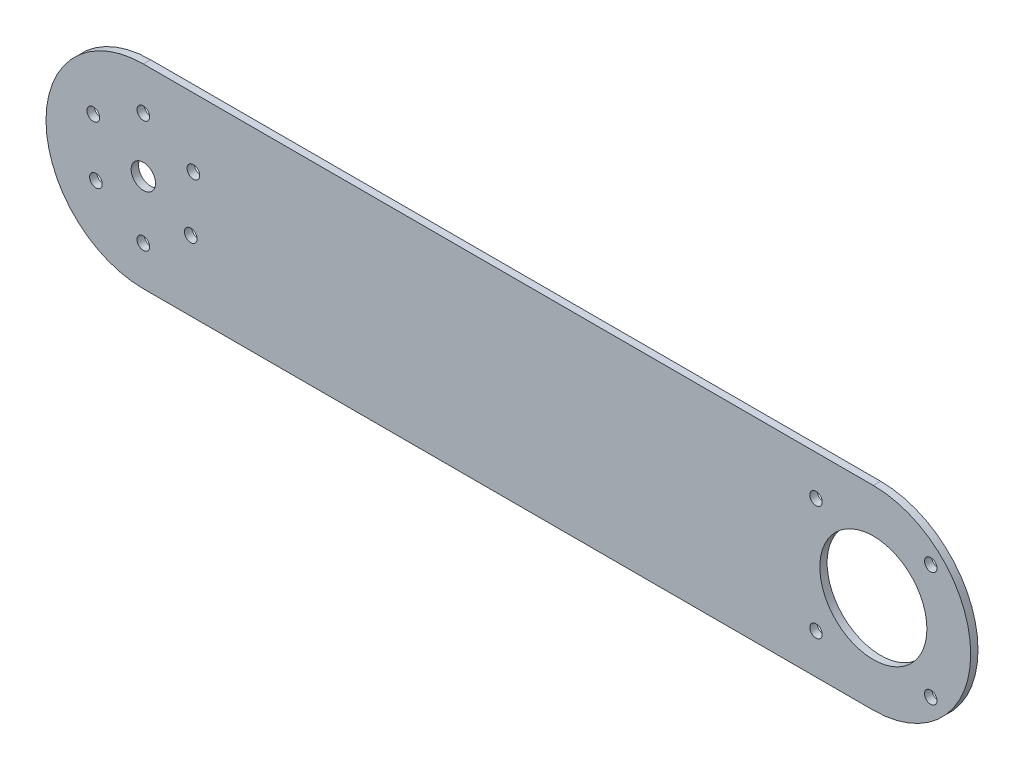
ISO-10303-21;
HEADER;
FILE_DESCRIPTION(('STEP AP214'),'2;1');
FILE_NAME('part.step','',(''),(''),'','','');
FILE_SCHEMA(('AUTOMOTIVE_DESIGN { 1 0 10303 214 1 1 1 1 }'));
ENDSEC;
DATA;
#1=APPLICATION_CONTEXT('core data for automotive mechanical design processes');
#2=APPLICATION_PROTOCOL_DEFINITION('international standard','automotive_design',2000,#1);
#3=PRODUCT_CONTEXT('',#1,'mechanical');
#4=PRODUCT('Part','Part','',(#3));
#5=PRODUCT_RELATED_PRODUCT_CATEGORY('part','',(#4));
#6=PRODUCT_DEFINITION_FORMATION('','',#4);
#7=PRODUCT_DEFINITION_CONTEXT('part definition',#1,'design');
#8=PRODUCT_DEFINITION('design','',#6,#7);
#9=PRODUCT_DEFINITION_SHAPE('','',#8);
#10=(LENGTH_UNIT() NAMED_UNIT(*) SI_UNIT(.MILLI.,.METRE.));
#11=(NAMED_UNIT(*) PLANE_ANGLE_UNIT() SI_UNIT($,.RADIAN.));
#12=(NAMED_UNIT(*) SI_UNIT($,.STERADIAN.) SOLID_ANGLE_UNIT());
#13=UNCERTAINTY_MEASURE_WITH_UNIT(LENGTH_MEASURE(1.E-05),#10,'distance_accuracy_value','');
#14=(GEOMETRIC_REPRESENTATION_CONTEXT(3) GLOBAL_UNCERTAINTY_ASSIGNED_CONTEXT((#13)) GLOBAL_UNIT_ASSIGNED_CONTEXT((#10,
#11,#12)) REPRESENTATION_CONTEXT('',''));
#15=CARTESIAN_POINT('',(0.,0.,0.));
#16=DIRECTION('',(0.,0.,1.));
#17=DIRECTION('',(1.,0.,0.));
#18=AXIS2_PLACEMENT_3D('',#15,#16,#17);
#19=CARTESIAN_POINT('',(-3.82354836323778,4.64395606456334,3.));
#20=DIRECTION('',(0.,0.,1.));
#21=DIRECTION('',(1.,0.,0.));
#22=AXIS2_PLACEMENT_3D('',#19,#20,#21);
#23=PLANE('',#22);
#24=CARTESIAN_POINT('',(272.606451636763,-18.9260439354365,3.));
#25=DIRECTION('',(0.,0.,1.));
#26=DIRECTION('',(1.,0.,0.));
#27=AXIS2_PLACEMENT_3D('',#24,#25,#26);
#28=CIRCLE('',#27,2.54999999999998);
#29=CARTESIAN_POINT('',(275.156451636763,-18.9260439354365,3.));
#30=VERTEX_POINT('',#29);
#31=EDGE_CURVE('E172',#30,#30,#28,.T.);
#32=ORIENTED_EDGE('',*,*,#31,.F.);
#33=EDGE_LOOP('',(#32));
#34=FACE_BOUND('',#33,.T.);
#35=CARTESIAN_POINT('',(319.746451636762,28.2139560645639,3.));
#36=DIRECTION('',(0.,0.,1.));
#37=DIRECTION('',(1.,0.,0.));
#38=AXIS2_PLACEMENT_3D('',#35,#36,#37);
#39=CIRCLE('',#38,2.55);
#40=CARTESIAN_POINT('',(322.296451636762,28.2139560645639,3.));
#41=VERTEX_POINT('',#40);
#42=EDGE_CURVE('E160',#41,#41,#39,.T.);
#43=ORIENTED_EDGE('',*,*,#42,.F.);
#44=EDGE_LOOP('',(#43));
#45=FACE_BOUND('',#44,.T.);
#46=CARTESIAN_POINT('',(-23.3091199483877,-6.60604393543656,3.));
#47=DIRECTION('',(0.,0.,1.));
#48=DIRECTION('',(1.,0.,0.));
#49=AXIS2_PLACEMENT_3D('',#46,#47,#48);
#50=CIRCLE('',#49,2.6);
#51=CARTESIAN_POINT('',(-20.7091199483877,-6.60604393543656,3.));
#52=VERTEX_POINT('',#51);
#53=EDGE_CURVE('E148',#52,#52,#50,.T.);
#54=ORIENTED_EDGE('',*,*,#53,.F.);
#55=EDGE_LOOP('',(#54));
#56=FACE_BOUND('',#55,.T.);
#57=CARTESIAN_POINT('',(296.176451636762,4.64395606456334,3.));
#58=DIRECTION('',(0.,0.,1.));
#59=DIRECTION('',(1.,0.,0.));
#60=AXIS2_PLACEMENT_3D('',#57,#58,#59);
#61=CIRCLE('',#60,22.);
#62=CARTESIAN_POINT('',(318.176451636762,4.64395606456334,3.));
#63=VERTEX_POINT('',#62);
#64=EDGE_CURVE('E136',#63,#63,#61,.T.);
#65=ORIENTED_EDGE('',*,*,#64,.F.);
#66=EDGE_LOOP('',(#65));
#67=FACE_BOUND('',#66,.T.);
#68=CARTESIAN_POINT('',(-24.3916517031181,16.5189560645634,3.));
#69=DIRECTION('',(0.,0.,1.));
#70=DIRECTION('',(1.,0.,0.));
#71=AXIS2_PLACEMENT_3D('',#68,#69,#70);
#72=CIRCLE('',#71,2.6);
#73=CARTESIAN_POINT('',(-21.7916517031181,16.5189560645634,3.));
#74=VERTEX_POINT('',#73);
#75=EDGE_CURVE('E124',#74,#74,#72,.T.);
#76=ORIENTED_EDGE('',*,*,#75,.F.);
#77=EDGE_LOOP('',(#76));
#78=FACE_BOUND('',#77,.T.);
#79=CARTESIAN_POINT('',(-3.82354836323778,-19.1060439354367,3.));
#80=DIRECTION('',(0.,0.,1.));
#81=DIRECTION('',(1.,0.,0.));
#82=AXIS2_PLACEMENT_3D('',#79,#80,#81);
#83=CIRCLE('',#82,2.6);
#84=CARTESIAN_POINT('',(-1.22354836323778,-19.1060439354367,3.));
#85=VERTEX_POINT('',#84);
#86=EDGE_CURVE('E103',#85,#85,#83,.T.);
#87=ORIENTED_EDGE('',*,*,#86,.F.);
#88=EDGE_LOOP('',(#87));
#89=FACE_BOUND('',#88,.T.);
#90=CARTESIAN_POINT('',(-3.82354836323778,4.64395606456334,3.));
#91=DIRECTION('',(0.,0.,1.));
#92=DIRECTION('',(1.,0.,0.));
#93=AXIS2_PLACEMENT_3D('',#90,#91,#92);
#94=CIRCLE('',#93,40.);
#95=CARTESIAN_POINT('',(-3.82354836323773,44.6439560645634,3.));
#96=VERTEX_POINT('',#95);
#97=CARTESIAN_POINT('',(-3.82354836323773,-35.3560439354366,3.));
#98=VERTEX_POINT('',#97);
#99=EDGE_CURVE('E88',#96,#98,#94,.T.);
#100=ORIENTED_EDGE('',*,*,#99,.T.);
#101=DIRECTION('',(1.,0.,0.));
#102=VECTOR('',#101,1.);
#103=CARTESIAN_POINT('',(-3.82354836323773,-35.3560439354366,3.));
#104=LINE('',#103,#102);
#105=CARTESIAN_POINT('',(296.176451636762,-35.3560439354367,3.));
#106=VERTEX_POINT('',#105);
#107=EDGE_CURVE('E83',#98,#106,#104,.T.);
#108=ORIENTED_EDGE('',*,*,#107,.T.);
#109=CARTESIAN_POINT('',(296.176451636762,4.64395606456334,3.));
#110=DIRECTION('',(0.,0.,1.));
#111=DIRECTION('',(-1.,0.,0.));
#112=AXIS2_PLACEMENT_3D('',#109,#110,#111);
#113=CIRCLE('',#112,40.);
#114=CARTESIAN_POINT('',(296.176451636762,44.6439560645634,3.));
#115=VERTEX_POINT('',#114);
#116=EDGE_CURVE('E86',#106,#115,#113,.T.);
#117=ORIENTED_EDGE('',*,*,#116,.T.);
#118=DIRECTION('',(-1.,0.,0.));
#119=VECTOR('',#118,1.);
#120=CARTESIAN_POINT('',(-3.82354836323773,44.6439560645634,3.));
#121=LINE('',#120,#119);
#122=EDGE_CURVE('E53',#115,#96,#121,.T.);
#123=ORIENTED_EDGE('',*,*,#122,.T.);
#124=EDGE_LOOP('',(#100,#108,#117,#123));
#125=FACE_BOUND('',#124,.T.);
#126=CARTESIAN_POINT('',(15.6620232219121,-6.60604393543667,3.));
#127=DIRECTION('',(0.,0.,1.));
#128=DIRECTION('',(1.,0.,0.));
#129=AXIS2_PLACEMENT_3D('',#126,#127,#128);
#130=CIRCLE('',#129,2.59999999999999);
#131=CARTESIAN_POINT('',(18.2620232219121,-6.60604393543667,3.));
#132=VERTEX_POINT('',#131);
#133=EDGE_CURVE('E118',#132,#132,#130,.T.);
#134=ORIENTED_EDGE('',*,*,#133,.F.);
#135=EDGE_LOOP('',(#134));
#136=FACE_BOUND('',#135,.T.);
#137=CARTESIAN_POINT('',(16.7445549766427,16.5189560645631,3.));
#138=DIRECTION('',(0.,0.,1.));
#139=DIRECTION('',(1.,0.,0.));
#140=AXIS2_PLACEMENT_3D('',#137,#138,#139);
#141=CIRCLE('',#140,2.6);
#142=CARTESIAN_POINT('',(19.3445549766427,16.5189560645631,3.));
#143=VERTEX_POINT('',#142);
#144=EDGE_CURVE('E130',#143,#143,#141,.T.);
#145=ORIENTED_EDGE('',*,*,#144,.F.);
#146=EDGE_LOOP('',(#145));
#147=FACE_BOUND('',#146,.T.);
#148=CARTESIAN_POINT('',(272.606451636762,28.2139560645634,3.));
#149=DIRECTION('',(0.,0.,1.));
#150=DIRECTION('',(1.,0.,0.));
#151=AXIS2_PLACEMENT_3D('',#148,#149,#150);
#152=CIRCLE('',#151,2.54999999999999);
#153=CARTESIAN_POINT('',(275.156451636762,28.2139560645634,3.));
#154=VERTEX_POINT('',#153);
#155=EDGE_CURVE('E142',#154,#154,#152,.T.);
#156=ORIENTED_EDGE('',*,*,#155,.F.);
#157=EDGE_LOOP('',(#156));
#158=FACE_BOUND('',#157,.T.);
#159=CARTESIAN_POINT('',(-3.82354836323756,27.1439560645633,3.));
#160=DIRECTION('',(0.,0.,1.));
#161=DIRECTION('',(1.,0.,0.));
#162=AXIS2_PLACEMENT_3D('',#159,#160,#161);
#163=CIRCLE('',#162,2.6);
#164=CARTESIAN_POINT('',(-1.22354836323757,27.1439560645633,3.));
#165=VERTEX_POINT('',#164);
#166=EDGE_CURVE('E154',#165,#165,#163,.T.);
#167=ORIENTED_EDGE('',*,*,#166,.F.);
#168=EDGE_LOOP('',(#167));
#169=FACE_BOUND('',#168,.T.);
#170=CARTESIAN_POINT('',(319.746451636763,-18.9260439354362,3.));
#171=DIRECTION('',(0.,0.,1.));
#172=DIRECTION('',(1.,0.,0.));
#173=AXIS2_PLACEMENT_3D('',#170,#171,#172);
#174=CIRCLE('',#173,2.54999999999999);
#175=CARTESIAN_POINT('',(322.296451636763,-18.9260439354362,3.));
#176=VERTEX_POINT('',#175);
#177=EDGE_CURVE('E166',#176,#176,#174,.T.);
#178=ORIENTED_EDGE('',*,*,#177,.F.);
#179=EDGE_LOOP('',(#178));
#180=FACE_BOUND('',#179,.T.);
#181=CARTESIAN_POINT('',(-3.82354836323778,4.64395606456334,3.));
#182=DIRECTION('',(0.,0.,1.));
#183=DIRECTION('',(1.,0.,0.));
#184=AXIS2_PLACEMENT_3D('',#181,#182,#183);
#185=CIRCLE('',#184,5.);
#186=CARTESIAN_POINT('',(1.17645163676222,4.64395606456334,3.));
#187=VERTEX_POINT('',#186);
#188=EDGE_CURVE('E178',#187,#187,#185,.T.);
#189=ORIENTED_EDGE('',*,*,#188,.F.);
#190=EDGE_LOOP('',(#189));
#191=FACE_BOUND('',#190,.T.);
#192=ADVANCED_FACE('F36',(#34,#45,#56,#67,#78,#89,#125,#136,#147,#158,#169,#180,#191),#23,.T.);
#193=CARTESIAN_POINT('',(-3.82354836323778,4.64395606456334,0.));
#194=DIRECTION('',(0.,0.,1.));
#195=DIRECTION('',(1.,0.,0.));
#196=AXIS2_PLACEMENT_3D('',#193,#194,#195);
#197=PLANE('',#196);
#198=CARTESIAN_POINT('',(-3.82354836323778,4.64395606456334,0.));
#199=DIRECTION('',(0.,0.,1.));
#200=DIRECTION('',(1.,0.,0.));
#201=AXIS2_PLACEMENT_3D('',#198,#199,#200);
#202=CIRCLE('',#201,40.);
#203=CARTESIAN_POINT('',(-3.82354836323773,44.6439560645634,0.));
#204=VERTEX_POINT('',#203);
#205=CARTESIAN_POINT('',(-3.82354836323773,-35.3560439354366,0.));
#206=VERTEX_POINT('',#205);
#207=EDGE_CURVE('E100',#204,#206,#202,.T.);
#208=ORIENTED_EDGE('',*,*,#207,.F.);
#209=DIRECTION('',(-1.,0.,0.));
#210=VECTOR('',#209,1.);
#211=CARTESIAN_POINT('',(-3.82354836323773,44.6439560645634,0.));
#212=LINE('',#211,#210);
#213=CARTESIAN_POINT('',(296.176451636762,44.6439560645634,0.));
#214=VERTEX_POINT('',#213);
#215=EDGE_CURVE('E76',#214,#204,#212,.T.);
#216=ORIENTED_EDGE('',*,*,#215,.F.);
#217=CARTESIAN_POINT('',(296.176451636762,4.64395606456334,0.));
#218=DIRECTION('',(0.,0.,1.));
#219=DIRECTION('',(-1.,0.,0.));
#220=AXIS2_PLACEMENT_3D('',#217,#218,#219);
#221=CIRCLE('',#220,40.);
#222=CARTESIAN_POINT('',(296.176451636762,-35.3560439354367,0.));
#223=VERTEX_POINT('',#222);
#224=EDGE_CURVE('E70',#223,#214,#221,.T.);
#225=ORIENTED_EDGE('',*,*,#224,.F.);
#226=DIRECTION('',(1.,0.,0.));
#227=VECTOR('',#226,1.);
#228=CARTESIAN_POINT('',(-3.82354836323773,-35.3560439354366,0.));
#229=LINE('',#228,#227);
#230=EDGE_CURVE('E92',#206,#223,#229,.T.);
#231=ORIENTED_EDGE('',*,*,#230,.F.);
#232=EDGE_LOOP('',(#208,#216,#225,#231));
#233=FACE_BOUND('',#232,.T.);
#234=CARTESIAN_POINT('',(-3.82354836323778,-19.1060439354367,0.));
#235=DIRECTION('',(0.,0.,1.));
#236=DIRECTION('',(1.,0.,0.));
#237=AXIS2_PLACEMENT_3D('',#234,#235,#236);
#238=CIRCLE('',#237,2.6);
#239=CARTESIAN_POINT('',(-1.22354836323778,-19.1060439354367,0.));
#240=VERTEX_POINT('',#239);
#241=EDGE_CURVE('E115',#240,#240,#238,.T.);
#242=ORIENTED_EDGE('',*,*,#241,.T.);
#243=EDGE_LOOP('',(#242));
#244=FACE_BOUND('',#243,.T.);
#245=CARTESIAN_POINT('',(15.6620232219121,-6.60604393543667,0.));
#246=DIRECTION('',(0.,0.,1.));
#247=DIRECTION('',(1.,0.,0.));
#248=AXIS2_PLACEMENT_3D('',#245,#246,#247);
#249=CIRCLE('',#248,2.59999999999999);
#250=CARTESIAN_POINT('',(18.2620232219121,-6.60604393543667,0.));
#251=VERTEX_POINT('',#250);
#252=EDGE_CURVE('E121',#251,#251,#249,.T.);
#253=ORIENTED_EDGE('',*,*,#252,.T.);
#254=EDGE_LOOP('',(#253));
#255=FACE_BOUND('',#254,.T.);
#256=CARTESIAN_POINT('',(-24.3916517031181,16.5189560645634,0.));
#257=DIRECTION('',(0.,0.,1.));
#258=DIRECTION('',(1.,0.,0.));
#259=AXIS2_PLACEMENT_3D('',#256,#257,#258);
#260=CIRCLE('',#259,2.6);
#261=CARTESIAN_POINT('',(-21.7916517031181,16.5189560645634,0.));
#262=VERTEX_POINT('',#261);
#263=EDGE_CURVE('E127',#262,#262,#260,.T.);
#264=ORIENTED_EDGE('',*,*,#263,.T.);
#265=EDGE_LOOP('',(#264));
#266=FACE_BOUND('',#265,.T.);
#267=CARTESIAN_POINT('',(16.7445549766427,16.5189560645631,0.));
#268=DIRECTION('',(0.,0.,1.));
#269=DIRECTION('',(1.,0.,0.));
#270=AXIS2_PLACEMENT_3D('',#267,#268,#269);
#271=CIRCLE('',#270,2.6);
#272=CARTESIAN_POINT('',(19.3445549766427,16.5189560645631,0.));
#273=VERTEX_POINT('',#272);
#274=EDGE_CURVE('E133',#273,#273,#271,.T.);
#275=ORIENTED_EDGE('',*,*,#274,.T.);
#276=EDGE_LOOP('',(#275));
#277=FACE_BOUND('',#276,.T.);
#278=CARTESIAN_POINT('',(296.176451636762,4.64395606456334,0.));
#279=DIRECTION('',(0.,0.,1.));
#280=DIRECTION('',(1.,0.,0.));
#281=AXIS2_PLACEMENT_3D('',#278,#279,#280);
#282=CIRCLE('',#281,22.);
#283=CARTESIAN_POINT('',(318.176451636762,4.64395606456334,0.));
#284=VERTEX_POINT('',#283);
#285=EDGE_CURVE('E139',#284,#284,#282,.T.);
#286=ORIENTED_EDGE('',*,*,#285,.T.);
#287=EDGE_LOOP('',(#286));
#288=FACE_BOUND('',#287,.T.);
#289=CARTESIAN_POINT('',(272.606451636762,28.2139560645634,0.));
#290=DIRECTION('',(0.,0.,1.));
#291=DIRECTION('',(1.,0.,0.));
#292=AXIS2_PLACEMENT_3D('',#289,#290,#291);
#293=CIRCLE('',#292,2.54999999999999);
#294=CARTESIAN_POINT('',(275.156451636762,28.2139560645634,0.));
#295=VERTEX_POINT('',#294);
#296=EDGE_CURVE('E145',#295,#295,#293,.T.);
#297=ORIENTED_EDGE('',*,*,#296,.T.);
#298=EDGE_LOOP('',(#297));
#299=FACE_BOUND('',#298,.T.);
#300=CARTESIAN_POINT('',(-23.3091199483877,-6.60604393543656,0.));
#301=DIRECTION('',(0.,0.,1.));
#302=DIRECTION('',(1.,0.,0.));
#303=AXIS2_PLACEMENT_3D('',#300,#301,#302);
#304=CIRCLE('',#303,2.6);
#305=CARTESIAN_POINT('',(-20.7091199483877,-6.60604393543656,0.));
#306=VERTEX_POINT('',#305);
#307=EDGE_CURVE('E151',#306,#306,#304,.T.);
#308=ORIENTED_EDGE('',*,*,#307,.T.);
#309=EDGE_LOOP('',(#308));
#310=FACE_BOUND('',#309,.T.);
#311=CARTESIAN_POINT('',(-3.82354836323756,27.1439560645633,0.));
#312=DIRECTION('',(0.,0.,1.));
#313=DIRECTION('',(1.,0.,0.));
#314=AXIS2_PLACEMENT_3D('',#311,#312,#313);
#315=CIRCLE('',#314,2.6);
#316=CARTESIAN_POINT('',(-1.22354836323757,27.1439560645633,0.));
#317=VERTEX_POINT('',#316);
#318=EDGE_CURVE('E157',#317,#317,#315,.T.);
#319=ORIENTED_EDGE('',*,*,#318,.T.);
#320=EDGE_LOOP('',(#319));
#321=FACE_BOUND('',#320,.T.);
#322=CARTESIAN_POINT('',(319.746451636762,28.2139560645639,0.));
#323=DIRECTION('',(0.,0.,1.));
#324=DIRECTION('',(1.,0.,0.));
#325=AXIS2_PLACEMENT_3D('',#322,#323,#324);
#326=CIRCLE('',#325,2.55);
#327=CARTESIAN_POINT('',(322.296451636762,28.2139560645639,0.));
#328=VERTEX_POINT('',#327);
#329=EDGE_CURVE('E163',#328,#328,#326,.T.);
#330=ORIENTED_EDGE('',*,*,#329,.T.);
#331=EDGE_LOOP('',(#330));
#332=FACE_BOUND('',#331,.T.);
#333=CARTESIAN_POINT('',(319.746451636763,-18.9260439354362,0.));
#334=DIRECTION('',(0.,0.,1.));
#335=DIRECTION('',(1.,0.,0.));
#336=AXIS2_PLACEMENT_3D('',#333,#334,#335);
#337=CIRCLE('',#336,2.54999999999999);
#338=CARTESIAN_POINT('',(322.296451636763,-18.9260439354362,0.));
#339=VERTEX_POINT('',#338);
#340=EDGE_CURVE('E169',#339,#339,#337,.T.);
#341=ORIENTED_EDGE('',*,*,#340,.T.);
#342=EDGE_LOOP('',(#341));
#343=FACE_BOUND('',#342,.T.);
#344=CARTESIAN_POINT('',(272.606451636763,-18.9260439354365,0.));
#345=DIRECTION('',(0.,0.,1.));
#346=DIRECTION('',(1.,0.,0.));
#347=AXIS2_PLACEMENT_3D('',#344,#345,#346);
#348=CIRCLE('',#347,2.54999999999998);
#349=CARTESIAN_POINT('',(275.156451636763,-18.9260439354365,0.));
#350=VERTEX_POINT('',#349);
#351=EDGE_CURVE('E175',#350,#350,#348,.T.);
#352=ORIENTED_EDGE('',*,*,#351,.T.);
#353=EDGE_LOOP('',(#352));
#354=FACE_BOUND('',#353,.T.);
#355=CARTESIAN_POINT('',(-3.82354836323778,4.64395606456334,0.));
#356=DIRECTION('',(0.,0.,1.));
#357=DIRECTION('',(1.,0.,0.));
#358=AXIS2_PLACEMENT_3D('',#355,#356,#357);
#359=CIRCLE('',#358,5.);
#360=CARTESIAN_POINT('',(1.17645163676222,4.64395606456334,0.));
#361=VERTEX_POINT('',#360);
#362=EDGE_CURVE('E181',#361,#361,#359,.T.);
#363=ORIENTED_EDGE('',*,*,#362,.T.);
#364=EDGE_LOOP('',(#363));
#365=FACE_BOUND('',#364,.T.);
#366=ADVANCED_FACE('F111',(#233,#244,#255,#266,#277,#288,#299,#310,#321,#332,#343,#354,#365),
#197,.F.);
#367=CARTESIAN_POINT('',(-3.82354836323778,4.64395606456334,3.));
#368=DIRECTION('',(0.,0.,-1.));
#369=DIRECTION('',(-1.,0.,0.));
#370=AXIS2_PLACEMENT_3D('',#367,#368,#369);
#371=CYLINDRICAL_SURFACE('',#370,40.);
#372=ORIENTED_EDGE('',*,*,#207,.T.);
#373=DIRECTION('',(0.,0.,-1.));
#374=VECTOR('',#373,1.);
#375=CARTESIAN_POINT('',(-3.82354836323773,-35.3560439354366,3.));
#376=LINE('',#375,#374);
#377=EDGE_CURVE('E11',#98,#206,#376,.T.);
#378=ORIENTED_EDGE('',*,*,#377,.F.);
#379=ORIENTED_EDGE('',*,*,#99,.F.);
#380=DIRECTION('',(0.,0.,-1.));
#381=VECTOR('',#380,1.);
#382=CARTESIAN_POINT('',(-3.82354836323773,44.6439560645634,3.));
#383=LINE('',#382,#381);
#384=EDGE_CURVE('E96',#96,#204,#383,.T.);
#385=ORIENTED_EDGE('',*,*,#384,.T.);
#386=EDGE_LOOP('',(#372,#378,#379,#385));
#387=FACE_BOUND('',#386,.T.);
#388=ADVANCED_FACE('F38',(#387),#371,.T.);
#389=CARTESIAN_POINT('',(-3.82354836323773,-35.3560439354366,3.));
#390=DIRECTION('',(0.,1.,0.));
#391=DIRECTION('',(0.,0.,1.));
#392=AXIS2_PLACEMENT_3D('',#389,#390,#391);
#393=PLANE('',#392);
#394=ORIENTED_EDGE('',*,*,#230,.T.);
#395=DIRECTION('',(0.,0.,-1.));
#396=VECTOR('',#395,1.);
#397=CARTESIAN_POINT('',(296.176451636762,-35.3560439354367,3.));
#398=LINE('',#397,#396);
#399=EDGE_CURVE('E45',#106,#223,#398,.T.);
#400=ORIENTED_EDGE('',*,*,#399,.F.);
#401=ORIENTED_EDGE('',*,*,#107,.F.);
#402=ORIENTED_EDGE('',*,*,#377,.T.);
#403=EDGE_LOOP('',(#394,#400,#401,#402));
#404=FACE_BOUND('',#403,.T.);
#405=ADVANCED_FACE('F91',(#404),#393,.F.);
#406=CARTESIAN_POINT('',(296.176451636762,4.64395606456334,3.));
#407=DIRECTION('',(0.,0.,-1.));
#408=DIRECTION('',(-1.,0.,0.));
#409=AXIS2_PLACEMENT_3D('',#406,#407,#408);
#410=CYLINDRICAL_SURFACE('',#409,40.);
#411=ORIENTED_EDGE('',*,*,#224,.T.);
#412=DIRECTION('',(0.,0.,-1.));
#413=VECTOR('',#412,1.);
#414=CARTESIAN_POINT('',(296.176451636762,44.6439560645634,3.));
#415=LINE('',#414,#413);
#416=EDGE_CURVE('E93',#115,#214,#415,.T.);
#417=ORIENTED_EDGE('',*,*,#416,.F.);
#418=ORIENTED_EDGE('',*,*,#116,.F.);
#419=ORIENTED_EDGE('',*,*,#399,.T.);
#420=EDGE_LOOP('',(#411,#417,#418,#419));
#421=FACE_BOUND('',#420,.T.);
#422=ADVANCED_FACE('F94',(#421),#410,.T.);
#423=CARTESIAN_POINT('',(-3.82354836323773,44.6439560645634,3.));
#424=DIRECTION('',(0.,-1.,0.));
#425=DIRECTION('',(0.,0.,-1.));
#426=AXIS2_PLACEMENT_3D('',#423,#424,#425);
#427=PLANE('',#426);
#428=ORIENTED_EDGE('',*,*,#215,.T.);
#429=ORIENTED_EDGE('',*,*,#384,.F.);
#430=ORIENTED_EDGE('',*,*,#122,.F.);
#431=ORIENTED_EDGE('',*,*,#416,.T.);
#432=EDGE_LOOP('',(#428,#429,#430,#431));
#433=FACE_BOUND('',#432,.T.);
#434=ADVANCED_FACE('F108',(#433),#427,.F.);
#435=CARTESIAN_POINT('',(-3.82354836323778,-19.1060439354367,3.));
#436=DIRECTION('',(0.,0.,-1.));
#437=DIRECTION('',(-1.,0.,0.));
#438=AXIS2_PLACEMENT_3D('',#435,#436,#437);
#439=CYLINDRICAL_SURFACE('',#438,2.6);
#440=ORIENTED_EDGE('',*,*,#86,.T.);
#441=EDGE_LOOP('',(#440));
#442=FACE_BOUND('',#441,.T.);
#443=ORIENTED_EDGE('',*,*,#241,.F.);
#444=EDGE_LOOP('',(#443));
#445=FACE_BOUND('',#444,.T.);
#446=ADVANCED_FACE('F200',(#442,#445),#439,.F.);
#447=CARTESIAN_POINT('',(15.6620232219121,-6.60604393543667,3.));
#448=DIRECTION('',(0.,0.,-1.));
#449=DIRECTION('',(-1.,0.,0.));
#450=AXIS2_PLACEMENT_3D('',#447,#448,#449);
#451=CYLINDRICAL_SURFACE('',#450,2.59999999999999);
#452=ORIENTED_EDGE('',*,*,#133,.T.);
#453=EDGE_LOOP('',(#452));
#454=FACE_BOUND('',#453,.T.);
#455=ORIENTED_EDGE('',*,*,#252,.F.);
#456=EDGE_LOOP('',(#455));
#457=FACE_BOUND('',#456,.T.);
#458=ADVANCED_FACE('F246',(#454,#457),#451,.F.);
#459=CARTESIAN_POINT('',(-24.3916517031181,16.5189560645634,3.));
#460=DIRECTION('',(0.,0.,-1.));
#461=DIRECTION('',(-1.,0.,0.));
#462=AXIS2_PLACEMENT_3D('',#459,#460,#461);
#463=CYLINDRICAL_SURFACE('',#462,2.6);
#464=ORIENTED_EDGE('',*,*,#75,.T.);
#465=EDGE_LOOP('',(#464));
#466=FACE_BOUND('',#465,.T.);
#467=ORIENTED_EDGE('',*,*,#263,.F.);
#468=EDGE_LOOP('',(#467));
#469=FACE_BOUND('',#468,.T.);
#470=ADVANCED_FACE('F254',(#466,#469),#463,.F.);
#471=CARTESIAN_POINT('',(16.7445549766427,16.5189560645631,3.));
#472=DIRECTION('',(0.,0.,-1.));
#473=DIRECTION('',(-1.,0.,0.));
#474=AXIS2_PLACEMENT_3D('',#471,#472,#473);
#475=CYLINDRICAL_SURFACE('',#474,2.6);
#476=ORIENTED_EDGE('',*,*,#144,.T.);
#477=EDGE_LOOP('',(#476));
#478=FACE_BOUND('',#477,.T.);
#479=ORIENTED_EDGE('',*,*,#274,.F.);
#480=EDGE_LOOP('',(#479));
#481=FACE_BOUND('',#480,.T.);
#482=ADVANCED_FACE('F262',(#478,#481),#475,.F.);
#483=CARTESIAN_POINT('',(296.176451636762,4.64395606456334,3.));
#484=DIRECTION('',(0.,0.,-1.));
#485=DIRECTION('',(-1.,0.,0.));
#486=AXIS2_PLACEMENT_3D('',#483,#484,#485);
#487=CYLINDRICAL_SURFACE('',#486,22.);
#488=ORIENTED_EDGE('',*,*,#64,.T.);
#489=EDGE_LOOP('',(#488));
#490=FACE_BOUND('',#489,.T.);
#491=ORIENTED_EDGE('',*,*,#285,.F.);
#492=EDGE_LOOP('',(#491));
#493=FACE_BOUND('',#492,.T.);
#494=ADVANCED_FACE('F271',(#490,#493),#487,.F.);
#495=CARTESIAN_POINT('',(272.606451636762,28.2139560645634,3.));
#496=DIRECTION('',(0.,0.,-1.));
#497=DIRECTION('',(-1.,0.,0.));
#498=AXIS2_PLACEMENT_3D('',#495,#496,#497);
#499=CYLINDRICAL_SURFACE('',#498,2.54999999999999);
#500=ORIENTED_EDGE('',*,*,#155,.T.);
#501=EDGE_LOOP('',(#500));
#502=FACE_BOUND('',#501,.T.);
#503=ORIENTED_EDGE('',*,*,#296,.F.);
#504=EDGE_LOOP('',(#503));
#505=FACE_BOUND('',#504,.T.);
#506=ADVANCED_FACE('F280',(#502,#505),#499,.F.);
#507=CARTESIAN_POINT('',(-23.3091199483877,-6.60604393543656,3.));
#508=DIRECTION('',(0.,0.,-1.));
#509=DIRECTION('',(-1.,0.,0.));
#510=AXIS2_PLACEMENT_3D('',#507,#508,#509);
#511=CYLINDRICAL_SURFACE('',#510,2.6);
#512=ORIENTED_EDGE('',*,*,#53,.T.);
#513=EDGE_LOOP('',(#512));
#514=FACE_BOUND('',#513,.T.);
#515=ORIENTED_EDGE('',*,*,#307,.F.);
#516=EDGE_LOOP('',(#515));
#517=FACE_BOUND('',#516,.T.);
#518=ADVANCED_FACE('F289',(#514,#517),#511,.F.);
#519=CARTESIAN_POINT('',(-3.82354836323756,27.1439560645633,3.));
#520=DIRECTION('',(0.,0.,-1.));
#521=DIRECTION('',(-1.,0.,0.));
#522=AXIS2_PLACEMENT_3D('',#519,#520,#521);
#523=CYLINDRICAL_SURFACE('',#522,2.6);
#524=ORIENTED_EDGE('',*,*,#166,.T.);
#525=EDGE_LOOP('',(#524));
#526=FACE_BOUND('',#525,.T.);
#527=ORIENTED_EDGE('',*,*,#318,.F.);
#528=EDGE_LOOP('',(#527));
#529=FACE_BOUND('',#528,.T.);
#530=ADVANCED_FACE('F298',(#526,#529),#523,.F.);
#531=CARTESIAN_POINT('',(319.746451636762,28.2139560645639,3.));
#532=DIRECTION('',(0.,0.,-1.));
#533=DIRECTION('',(-1.,0.,0.));
#534=AXIS2_PLACEMENT_3D('',#531,#532,#533);
#535=CYLINDRICAL_SURFACE('',#534,2.55);
#536=ORIENTED_EDGE('',*,*,#42,.T.);
#537=EDGE_LOOP('',(#536));
#538=FACE_BOUND('',#537,.T.);
#539=ORIENTED_EDGE('',*,*,#329,.F.);
#540=EDGE_LOOP('',(#539));
#541=FACE_BOUND('',#540,.T.);
#542=ADVANCED_FACE('F307',(#538,#541),#535,.F.);
#543=CARTESIAN_POINT('',(319.746451636763,-18.9260439354362,3.));
#544=DIRECTION('',(0.,0.,-1.));
#545=DIRECTION('',(-1.,0.,0.));
#546=AXIS2_PLACEMENT_3D('',#543,#544,#545);
#547=CYLINDRICAL_SURFACE('',#546,2.54999999999999);
#548=ORIENTED_EDGE('',*,*,#177,.T.);
#549=EDGE_LOOP('',(#548));
#550=FACE_BOUND('',#549,.T.);
#551=ORIENTED_EDGE('',*,*,#340,.F.);
#552=EDGE_LOOP('',(#551));
#553=FACE_BOUND('',#552,.T.);
#554=ADVANCED_FACE('F316',(#550,#553),#547,.F.);
#555=CARTESIAN_POINT('',(272.606451636763,-18.9260439354365,3.));
#556=DIRECTION('',(0.,0.,-1.));
#557=DIRECTION('',(-1.,0.,0.));
#558=AXIS2_PLACEMENT_3D('',#555,#556,#557);
#559=CYLINDRICAL_SURFACE('',#558,2.54999999999998);
#560=ORIENTED_EDGE('',*,*,#31,.T.);
#561=EDGE_LOOP('',(#560));
#562=FACE_BOUND('',#561,.T.);
#563=ORIENTED_EDGE('',*,*,#351,.F.);
#564=EDGE_LOOP('',(#563));
#565=FACE_BOUND('',#564,.T.);
#566=ADVANCED_FACE('F325',(#562,#565),#559,.F.);
#567=CARTESIAN_POINT('',(-3.82354836323778,4.64395606456334,3.));
#568=DIRECTION('',(0.,0.,-1.));
#569=DIRECTION('',(-1.,0.,0.));
#570=AXIS2_PLACEMENT_3D('',#567,#568,#569);
#571=CYLINDRICAL_SURFACE('',#570,5.);
#572=ORIENTED_EDGE('',*,*,#188,.T.);
#573=EDGE_LOOP('',(#572));
#574=FACE_BOUND('',#573,.T.);
#575=ORIENTED_EDGE('',*,*,#362,.F.);
#576=EDGE_LOOP('',(#575));
#577=FACE_BOUND('',#576,.T.);
#578=ADVANCED_FACE('F187',(#574,#577),#571,.F.);
#579=CLOSED_SHELL('',(#192,#366,#388,#405,#422,#434,#446,#458,#470,#482,#494,#506,#518,#530,
#542,#554,#566,#578));
#580=MANIFOLD_SOLID_BREP('B2',#579);
#581=ADVANCED_BREP_SHAPE_REPRESENTATION('',(#18,#580),#14);
#582=SHAPE_DEFINITION_REPRESENTATION(#9,#581);
ENDSEC;
END-ISO-10303-21;
